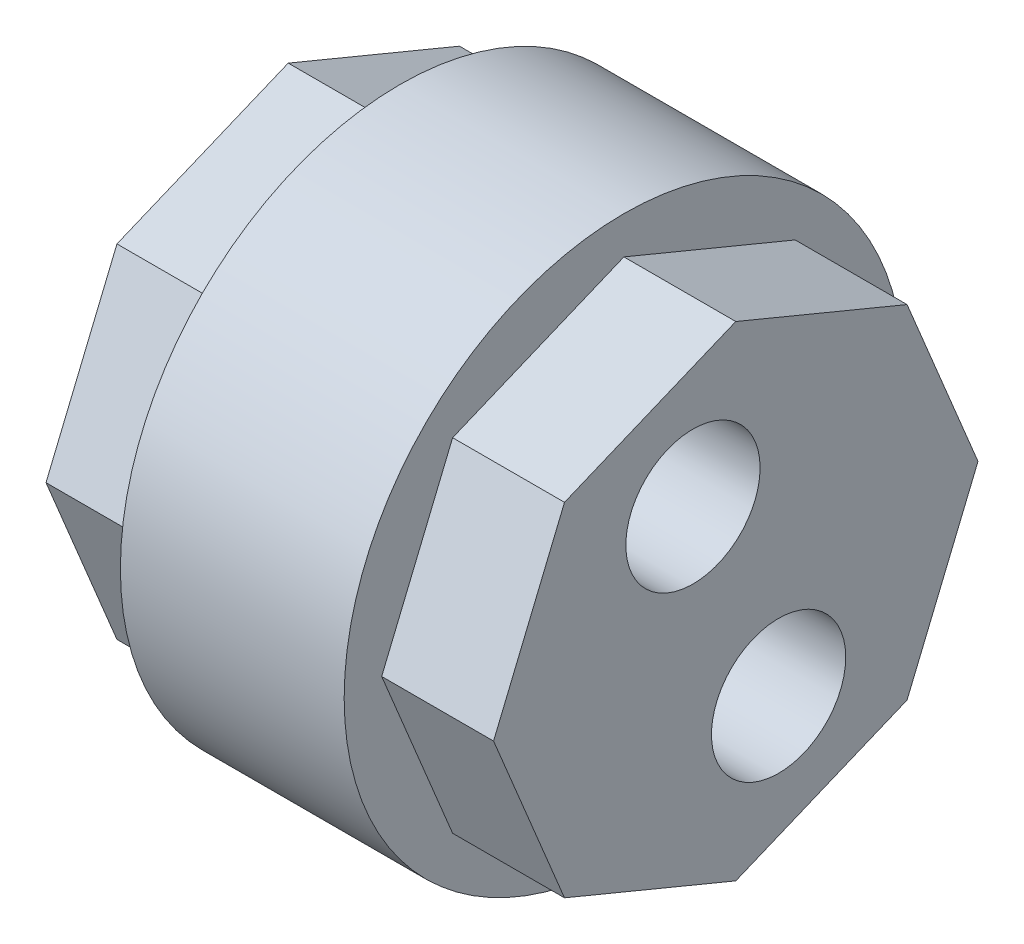
ISO-10303-21;
HEADER;
FILE_DESCRIPTION(('STEP AP214'),'2;1');
FILE_NAME('part.step','',(''),(''),'','','');
FILE_SCHEMA(('AUTOMOTIVE_DESIGN { 1 0 10303 214 1 1 1 1 }'));
ENDSEC;
DATA;
#1=APPLICATION_CONTEXT('core data for automotive mechanical design processes');
#2=APPLICATION_PROTOCOL_DEFINITION('international standard','automotive_design',2000,#1);
#3=PRODUCT_CONTEXT('',#1,'mechanical');
#4=PRODUCT('Part','Part','',(#3));
#5=PRODUCT_RELATED_PRODUCT_CATEGORY('part','',(#4));
#6=PRODUCT_DEFINITION_FORMATION('','',#4);
#7=PRODUCT_DEFINITION_CONTEXT('part definition',#1,'design');
#8=PRODUCT_DEFINITION('design','',#6,#7);
#9=PRODUCT_DEFINITION_SHAPE('','',#8);
#10=(LENGTH_UNIT() NAMED_UNIT(*) SI_UNIT(.MILLI.,.METRE.));
#11=(NAMED_UNIT(*) PLANE_ANGLE_UNIT() SI_UNIT($,.RADIAN.));
#12=(NAMED_UNIT(*) SI_UNIT($,.STERADIAN.) SOLID_ANGLE_UNIT());
#13=UNCERTAINTY_MEASURE_WITH_UNIT(LENGTH_MEASURE(1.E-05),#10,'distance_accuracy_value','');
#14=(GEOMETRIC_REPRESENTATION_CONTEXT(3) GLOBAL_UNCERTAINTY_ASSIGNED_CONTEXT((#13)) GLOBAL_UNIT_ASSIGNED_CONTEXT((#10,
#11,#12)) REPRESENTATION_CONTEXT('',''));
#15=CARTESIAN_POINT('',(0.,0.,0.));
#16=DIRECTION('',(0.,0.,1.));
#17=DIRECTION('',(1.,0.,0.));
#18=AXIS2_PLACEMENT_3D('',#15,#16,#17);
#19=CARTESIAN_POINT('',(15.,4.61939766255646,1.91341716182539));
#20=DIRECTION('',(-1.,0.,0.));
#21=DIRECTION('',(0.,0.,1.));
#22=AXIS2_PLACEMENT_3D('',#19,#20,#21);
#23=CYLINDRICAL_SURFACE('',#22,1.);
#24=CARTESIAN_POINT('',(0.,4.61939766255646,1.91341716182539));
#25=DIRECTION('',(-1.,0.,0.));
#26=DIRECTION('',(0.,0.,1.));
#27=AXIS2_PLACEMENT_3D('',#24,#25,#26);
#28=CIRCLE('',#27,1.);
#29=CARTESIAN_POINT('',(0.,4.61939766255646,2.91341716182539));
#30=VERTEX_POINT('',#29);
#31=EDGE_CURVE('E289',#30,#30,#28,.F.);
#32=ORIENTED_EDGE('',*,*,#31,.F.);
#33=EDGE_LOOP('',(#32));
#34=FACE_BOUND('',#33,.T.);
#35=CARTESIAN_POINT('',(5.,4.61939766255646,1.91341716182539));
#36=DIRECTION('',(1.,0.,0.));
#37=DIRECTION('',(0.,0.,-1.));
#38=AXIS2_PLACEMENT_3D('',#35,#36,#37);
#39=CIRCLE('',#38,1.);
#40=CARTESIAN_POINT('',(5.,4.61939766255646,0.913417161825395));
#41=VERTEX_POINT('',#40);
#42=EDGE_CURVE('E37',#41,#41,#39,.F.);
#43=ORIENTED_EDGE('',*,*,#42,.F.);
#44=EDGE_LOOP('',(#43));
#45=FACE_BOUND('',#44,.T.);
#46=ADVANCED_FACE('F33',(#34,#45),#23,.F.);
#47=CARTESIAN_POINT('',(15.,-4.61939766255646,-1.9134171618254));
#48=DIRECTION('',(-1.,0.,0.));
#49=DIRECTION('',(0.,0.,1.));
#50=AXIS2_PLACEMENT_3D('',#47,#48,#49);
#51=CYLINDRICAL_SURFACE('',#50,1.);
#52=CARTESIAN_POINT('',(0.,-4.61939766255646,-1.9134171618254));
#53=DIRECTION('',(-1.,0.,0.));
#54=DIRECTION('',(0.,0.,1.));
#55=AXIS2_PLACEMENT_3D('',#52,#53,#54);
#56=CIRCLE('',#55,1.);
#57=CARTESIAN_POINT('',(0.,-4.61939766255646,-0.913417161825397));
#58=VERTEX_POINT('',#57);
#59=EDGE_CURVE('E172',#58,#58,#56,.F.);
#60=ORIENTED_EDGE('',*,*,#59,.F.);
#61=EDGE_LOOP('',(#60));
#62=FACE_BOUND('',#61,.T.);
#63=CARTESIAN_POINT('',(5.,-4.61939766255646,-1.9134171618254));
#64=DIRECTION('',(1.,0.,0.));
#65=DIRECTION('',(0.,0.,-1.));
#66=AXIS2_PLACEMENT_3D('',#63,#64,#65);
#67=CIRCLE('',#66,1.);
#68=CARTESIAN_POINT('',(5.,-4.61939766255646,-2.9134171618254));
#69=VERTEX_POINT('',#68);
#70=EDGE_CURVE('E292',#69,#69,#67,.F.);
#71=ORIENTED_EDGE('',*,*,#70,.F.);
#72=EDGE_LOOP('',(#71));
#73=FACE_BOUND('',#72,.T.);
#74=ADVANCED_FACE('F337',(#62,#73),#51,.F.);
#75=CARTESIAN_POINT('',(10.,0.,0.));
#76=DIRECTION('',(-1.,0.,0.));
#77=DIRECTION('',(0.,0.,1.));
#78=AXIS2_PLACEMENT_3D('',#75,#76,#77);
#79=CYLINDRICAL_SURFACE('',#78,12.5);
#80=CARTESIAN_POINT('',(10.,0.,0.));
#81=DIRECTION('',(1.,0.,0.));
#82=DIRECTION('',(0.,0.,-1.));
#83=AXIS2_PLACEMENT_3D('',#80,#81,#82);
#84=CIRCLE('',#83,12.5);
#85=CARTESIAN_POINT('',(10.,0.,-12.5));
#86=VERTEX_POINT('',#85);
#87=EDGE_CURVE('E265',#86,#86,#84,.T.);
#88=ORIENTED_EDGE('',*,*,#87,.F.);
#89=EDGE_LOOP('',(#88));
#90=FACE_BOUND('',#89,.T.);
#91=CARTESIAN_POINT('',(0.,0.,0.));
#92=DIRECTION('',(1.,0.,0.));
#93=DIRECTION('',(0.,0.,-1.));
#94=AXIS2_PLACEMENT_3D('',#91,#92,#93);
#95=CIRCLE('',#94,12.5);
#96=CARTESIAN_POINT('',(0.,0.,-12.5));
#97=VERTEX_POINT('',#96);
#98=EDGE_CURVE('E264',#97,#97,#95,.T.);
#99=ORIENTED_EDGE('',*,*,#98,.T.);
#100=EDGE_LOOP('',(#99));
#101=FACE_BOUND('',#100,.T.);
#102=ADVANCED_FACE('F35',(#90,#101),#79,.T.);
#103=CARTESIAN_POINT('',(10.,0.,0.));
#104=DIRECTION('',(1.,0.,0.));
#105=DIRECTION('',(0.,0.,-1.));
#106=AXIS2_PLACEMENT_3D('',#103,#104,#105);
#107=PLANE('',#106);
#108=DIRECTION('',(0.,-0.923879532511291,-0.382683432365079));
#109=VECTOR('',#108,1.);
#110=CARTESIAN_POINT('',(10.,-3.82683432365079,9.23879532511291));
#111=LINE('',#110,#109);
#112=CARTESIAN_POINT('',(10.,1.24878290032368E-13,10.8239220029239));
#113=VERTEX_POINT('',#112);
#114=CARTESIAN_POINT('',(10.,-7.65366864730171,7.65366864730188));
#115=VERTEX_POINT('',#114);
#116=EDGE_CURVE('E262',#113,#115,#111,.T.);
#117=ORIENTED_EDGE('',*,*,#116,.F.);
#118=DIRECTION('',(0.,-0.923879532511282,0.3826834323651));
#119=VECTOR('',#118,1.);
#120=CARTESIAN_POINT('',(10.,3.826834323651,9.23879532511282));
#121=LINE('',#120,#119);
#122=CARTESIAN_POINT('',(10.,7.65366864730189,7.65366864730171));
#123=VERTEX_POINT('',#122);
#124=EDGE_CURVE('E220',#123,#113,#121,.T.);
#125=ORIENTED_EDGE('',*,*,#124,.F.);
#126=DIRECTION('',(0.,-0.382683432365079,0.923879532511291));
#127=VECTOR('',#126,1.);
#128=CARTESIAN_POINT('',(10.,9.23879532511291,3.82683432365079));
#129=LINE('',#128,#127);
#130=CARTESIAN_POINT('',(10.,10.8239220029239,-1.27068494615301E-13));
#131=VERTEX_POINT('',#130);
#132=EDGE_CURVE('E248',#131,#123,#129,.T.);
#133=ORIENTED_EDGE('',*,*,#132,.F.);
#134=DIRECTION('',(0.,0.3826834323651,0.923879532511282));
#135=VECTOR('',#134,1.);
#136=CARTESIAN_POINT('',(10.,9.23879532511282,-3.826834323651));
#137=LINE('',#136,#135);
#138=CARTESIAN_POINT('',(10.,7.65366864730171,-7.65366864730189));
#139=VERTEX_POINT('',#138);
#140=EDGE_CURVE('E251',#139,#131,#137,.T.);
#141=ORIENTED_EDGE('',*,*,#140,.F.);
#142=DIRECTION('',(0.,0.923879532511292,0.382683432365079));
#143=VECTOR('',#142,1.);
#144=CARTESIAN_POINT('',(10.,3.82683432365079,-9.23879532511291));
#145=LINE('',#144,#143);
#146=CARTESIAN_POINT('',(10.,-1.30537941567255E-13,-10.8239220029239));
#147=VERTEX_POINT('',#146);
#148=EDGE_CURVE('E254',#147,#139,#145,.T.);
#149=ORIENTED_EDGE('',*,*,#148,.F.);
#150=DIRECTION('',(0.,0.923879532511282,-0.382683432365101));
#151=VECTOR('',#150,1.);
#152=CARTESIAN_POINT('',(10.,-3.82683432365101,-9.23879532511283));
#153=LINE('',#152,#151);
#154=CARTESIAN_POINT('',(10.,-7.65366864730188,-7.65366864730171));
#155=VERTEX_POINT('',#154);
#156=EDGE_CURVE('E257',#155,#147,#153,.T.);
#157=ORIENTED_EDGE('',*,*,#156,.F.);
#158=DIRECTION('',(0.,0.382683432365079,-0.923879532511291));
#159=VECTOR('',#158,1.);
#160=CARTESIAN_POINT('',(10.,-9.23879532511291,-3.82683432365079));
#161=LINE('',#160,#159);
#162=CARTESIAN_POINT('',(10.,-10.8239220029239,1.25767452008319E-13));
#163=VERTEX_POINT('',#162);
#164=EDGE_CURVE('E55',#163,#155,#161,.T.);
#165=ORIENTED_EDGE('',*,*,#164,.F.);
#166=DIRECTION('',(0.,-0.3826834323651,-0.923879532511282));
#167=VECTOR('',#166,1.);
#168=CARTESIAN_POINT('',(10.,-9.23879532511283,3.826834323651));
#169=LINE('',#168,#167);
#170=EDGE_CURVE('E50',#115,#163,#169,.T.);
#171=ORIENTED_EDGE('',*,*,#170,.F.);
#172=EDGE_LOOP('',(#117,#125,#133,#141,#149,#157,#165,#171));
#173=FACE_BOUND('',#172,.T.);
#174=ORIENTED_EDGE('',*,*,#87,.T.);
#175=EDGE_LOOP('',(#174));
#176=FACE_BOUND('',#175,.T.);
#177=ADVANCED_FACE('F331',(#173,#176),#107,.T.);
#178=CARTESIAN_POINT('',(0.,0.,0.));
#179=DIRECTION('',(1.,0.,0.));
#180=DIRECTION('',(0.,0.,-1.));
#181=AXIS2_PLACEMENT_3D('',#178,#179,#180);
#182=PLANE('',#181);
#183=DIRECTION('',(0.,-0.923879532511282,0.3826834323651));
#184=VECTOR('',#183,1.);
#185=CARTESIAN_POINT('',(0.,3.826834323651,9.23879532511282));
#186=LINE('',#185,#184);
#187=CARTESIAN_POINT('',(0.,7.65366864730189,7.65366864730171));
#188=VERTEX_POINT('',#187);
#189=CARTESIAN_POINT('',(0.,1.24466409401336E-13,10.8239220029239));
#190=VERTEX_POINT('',#189);
#191=EDGE_CURVE('E268',#188,#190,#186,.T.);
#192=ORIENTED_EDGE('',*,*,#191,.T.);
#193=DIRECTION('',(0.,-0.923879532511291,-0.382683432365079));
#194=VECTOR('',#193,1.);
#195=CARTESIAN_POINT('',(0.,-3.82683432365079,9.23879532511291));
#196=LINE('',#195,#194);
#197=CARTESIAN_POINT('',(0.,-7.65366864730171,7.65366864730188));
#198=VERTEX_POINT('',#197);
#199=EDGE_CURVE('E11',#190,#198,#196,.T.);
#200=ORIENTED_EDGE('',*,*,#199,.T.);
#201=DIRECTION('',(0.,-0.3826834323651,-0.923879532511282));
#202=VECTOR('',#201,1.);
#203=CARTESIAN_POINT('',(0.,-9.23879532511283,3.826834323651));
#204=LINE('',#203,#202);
#205=CARTESIAN_POINT('',(0.,-10.8239220029239,1.26175578404566E-13));
#206=VERTEX_POINT('',#205);
#207=EDGE_CURVE('E42',#198,#206,#204,.T.);
#208=ORIENTED_EDGE('',*,*,#207,.T.);
#209=DIRECTION('',(0.,0.382683432365079,-0.923879532511291));
#210=VECTOR('',#209,1.);
#211=CARTESIAN_POINT('',(0.,-9.23879532511291,-3.82683432365079));
#212=LINE('',#211,#210);
#213=CARTESIAN_POINT('',(0.,-7.65366864730188,-7.65366864730171));
#214=VERTEX_POINT('',#213);
#215=EDGE_CURVE('E284',#206,#214,#212,.T.);
#216=ORIENTED_EDGE('',*,*,#215,.T.);
#217=DIRECTION('',(0.,0.923879532511282,-0.382683432365101));
#218=VECTOR('',#217,1.);
#219=CARTESIAN_POINT('',(0.,-3.82683432365101,-9.23879532511283));
#220=LINE('',#219,#218);
#221=CARTESIAN_POINT('',(0.,-1.30972173513795E-13,-10.8239220029239));
#222=VERTEX_POINT('',#221);
#223=EDGE_CURVE('E281',#214,#222,#220,.T.);
#224=ORIENTED_EDGE('',*,*,#223,.T.);
#225=DIRECTION('',(0.,0.923879532511292,0.382683432365079));
#226=VECTOR('',#225,1.);
#227=CARTESIAN_POINT('',(0.,3.82683432365079,-9.23879532511291));
#228=LINE('',#227,#226);
#229=CARTESIAN_POINT('',(0.,7.65366864730171,-7.65366864730189));
#230=VERTEX_POINT('',#229);
#231=EDGE_CURVE('E278',#222,#230,#228,.T.);
#232=ORIENTED_EDGE('',*,*,#231,.T.);
#233=DIRECTION('',(0.,0.3826834323651,0.923879532511282));
#234=VECTOR('',#233,1.);
#235=CARTESIAN_POINT('',(0.,9.23879532511282,-3.826834323651));
#236=LINE('',#235,#234);
#237=CARTESIAN_POINT('',(0.,10.8239220029239,-1.27569326949565E-13));
#238=VERTEX_POINT('',#237);
#239=EDGE_CURVE('E275',#230,#238,#236,.T.);
#240=ORIENTED_EDGE('',*,*,#239,.T.);
#241=DIRECTION('',(0.,-0.382683432365079,0.923879532511291));
#242=VECTOR('',#241,1.);
#243=CARTESIAN_POINT('',(0.,9.23879532511291,3.82683432365079));
#244=LINE('',#243,#242);
#245=EDGE_CURVE('E272',#238,#188,#244,.T.);
#246=ORIENTED_EDGE('',*,*,#245,.T.);
#247=EDGE_LOOP('',(#192,#200,#208,#216,#224,#232,#240,#246));
#248=FACE_BOUND('',#247,.T.);
#249=ORIENTED_EDGE('',*,*,#98,.F.);
#250=EDGE_LOOP('',(#249));
#251=FACE_BOUND('',#250,.T.);
#252=ADVANCED_FACE('F321',(#248,#251),#182,.F.);
#253=CARTESIAN_POINT('',(-5.,0.,0.));
#254=DIRECTION('',(-1.,0.,0.));
#255=DIRECTION('',(0.,0.,1.));
#256=AXIS2_PLACEMENT_3D('',#253,#254,#255);
#257=PLANE('',#256);
#258=CARTESIAN_POINT('',(-5.,4.61939766255646,1.91341716182539));
#259=DIRECTION('',(-1.,0.,0.));
#260=DIRECTION('',(0.,0.,1.));
#261=AXIS2_PLACEMENT_3D('',#258,#259,#260);
#262=CIRCLE('',#261,3.);
#263=CARTESIAN_POINT('',(-5.,4.61939766255646,4.91341716182539));
#264=VERTEX_POINT('',#263);
#265=EDGE_CURVE('E294',#264,#264,#262,.T.);
#266=ORIENTED_EDGE('',*,*,#265,.F.);
#267=EDGE_LOOP('',(#266));
#268=FACE_BOUND('',#267,.T.);
#269=CARTESIAN_POINT('',(-5.,-4.61939766255646,-1.9134171618254));
#270=DIRECTION('',(-1.,0.,0.));
#271=DIRECTION('',(0.,0.,1.));
#272=AXIS2_PLACEMENT_3D('',#269,#270,#271);
#273=CIRCLE('',#272,3.);
#274=CARTESIAN_POINT('',(-5.,-4.61939766255646,1.0865828381746));
#275=VERTEX_POINT('',#274);
#276=EDGE_CURVE('E178',#275,#275,#273,.T.);
#277=ORIENTED_EDGE('',*,*,#276,.F.);
#278=EDGE_LOOP('',(#277));
#279=FACE_BOUND('',#278,.T.);
#280=DIRECTION('',(0.,0.923879532511291,0.382683432365079));
#281=VECTOR('',#280,1.);
#282=CARTESIAN_POINT('',(-5.,-7.65366864730171,7.65366864730188));
#283=LINE('',#282,#281);
#284=CARTESIAN_POINT('',(-5.,-7.65366864730171,7.65366864730188));
#285=VERTEX_POINT('',#284);
#286=CARTESIAN_POINT('',(-5.,1.24878290032368E-13,10.8239220029239));
#287=VERTEX_POINT('',#286);
#288=EDGE_CURVE('E151',#285,#287,#283,.T.);
#289=ORIENTED_EDGE('',*,*,#288,.T.);
#290=DIRECTION('',(0.,0.923879532511282,-0.3826834323651));
#291=VECTOR('',#290,1.);
#292=CARTESIAN_POINT('',(-5.,1.24878290032368E-13,10.8239220029239));
#293=LINE('',#292,#291);
#294=CARTESIAN_POINT('',(-5.,7.65366864730189,7.65366864730171));
#295=VERTEX_POINT('',#294);
#296=EDGE_CURVE('E158',#287,#295,#293,.T.);
#297=ORIENTED_EDGE('',*,*,#296,.T.);
#298=DIRECTION('',(0.,0.382683432365079,-0.923879532511292));
#299=VECTOR('',#298,1.);
#300=CARTESIAN_POINT('',(-5.,7.65366864730189,7.65366864730171));
#301=LINE('',#300,#299);
#302=CARTESIAN_POINT('',(-5.,10.8239220029239,-1.27569326949565E-13));
#303=VERTEX_POINT('',#302);
#304=EDGE_CURVE('E165',#295,#303,#301,.T.);
#305=ORIENTED_EDGE('',*,*,#304,.T.);
#306=DIRECTION('',(0.,-0.3826834323651,-0.923879532511282));
#307=VECTOR('',#306,1.);
#308=CARTESIAN_POINT('',(-5.,10.8239220029239,-1.27569326949565E-13));
#309=LINE('',#308,#307);
#310=CARTESIAN_POINT('',(-5.,7.65366864730171,-7.65366864730189));
#311=VERTEX_POINT('',#310);
#312=EDGE_CURVE('E182',#303,#311,#309,.T.);
#313=ORIENTED_EDGE('',*,*,#312,.T.);
#314=DIRECTION('',(0.,-0.923879532511291,-0.382683432365079));
#315=VECTOR('',#314,1.);
#316=CARTESIAN_POINT('',(-5.,7.65366864730171,-7.65366864730189));
#317=LINE('',#316,#315);
#318=CARTESIAN_POINT('',(-5.,-1.30972173513795E-13,-10.8239220029239));
#319=VERTEX_POINT('',#318);
#320=EDGE_CURVE('E185',#311,#319,#317,.T.);
#321=ORIENTED_EDGE('',*,*,#320,.T.);
#322=DIRECTION('',(0.,-0.923879532511282,0.3826834323651));
#323=VECTOR('',#322,1.);
#324=CARTESIAN_POINT('',(-5.,-1.30972173513795E-13,-10.8239220029239));
#325=LINE('',#324,#323);
#326=CARTESIAN_POINT('',(-5.,-7.65366864730188,-7.65366864730171));
#327=VERTEX_POINT('',#326);
#328=EDGE_CURVE('E188',#319,#327,#325,.T.);
#329=ORIENTED_EDGE('',*,*,#328,.T.);
#330=DIRECTION('',(0.,-0.382683432365079,0.923879532511291));
#331=VECTOR('',#330,1.);
#332=CARTESIAN_POINT('',(-5.,-7.65366864730188,-7.65366864730171));
#333=LINE('',#332,#331);
#334=CARTESIAN_POINT('',(-5.,-10.8239220029239,1.26175578404566E-13));
#335=VERTEX_POINT('',#334);
#336=EDGE_CURVE('E191',#327,#335,#333,.T.);
#337=ORIENTED_EDGE('',*,*,#336,.T.);
#338=DIRECTION('',(0.,0.3826834323651,0.923879532511282));
#339=VECTOR('',#338,1.);
#340=CARTESIAN_POINT('',(-5.,-10.8239220029239,1.26175578404566E-13));
#341=LINE('',#340,#339);
#342=EDGE_CURVE('E171',#335,#285,#341,.T.);
#343=ORIENTED_EDGE('',*,*,#342,.T.);
#344=EDGE_LOOP('',(#289,#297,#305,#313,#321,#329,#337,#343));
#345=FACE_BOUND('',#344,.T.);
#346=ADVANCED_FACE('F168',(#268,#279,#345),#257,.T.);
#347=CARTESIAN_POINT('',(15.,1.24878290032368E-13,10.8239220029239));
#348=DIRECTION('',(0.,0.3826834323651,0.923879532511282));
#349=DIRECTION('',(0.,-0.923879532511282,0.3826834323651));
#350=AXIS2_PLACEMENT_3D('',#347,#348,#349);
#351=PLANE('',#350);
#352=ORIENTED_EDGE('',*,*,#191,.F.);
#353=DIRECTION('',(-1.,0.,0.));
#354=VECTOR('',#353,1.);
#355=CARTESIAN_POINT('',(15.,7.65366864730189,7.65366864730171));
#356=LINE('',#355,#354);
#357=EDGE_CURVE('E161',#188,#295,#356,.T.);
#358=ORIENTED_EDGE('',*,*,#357,.T.);
#359=ORIENTED_EDGE('',*,*,#296,.F.);
#360=DIRECTION('',(-1.,0.,0.));
#361=VECTOR('',#360,1.);
#362=CARTESIAN_POINT('',(15.,1.24878290032368E-13,10.8239220029239));
#363=LINE('',#362,#361);
#364=EDGE_CURVE('E146',#190,#287,#363,.T.);
#365=ORIENTED_EDGE('',*,*,#364,.F.);
#366=EDGE_LOOP('',(#352,#358,#359,#365));
#367=FACE_BOUND('',#366,.T.);
#368=ADVANCED_FACE('F159',(#367),#351,.T.);
#369=CARTESIAN_POINT('',(15.,7.65366864730189,7.65366864730171));
#370=DIRECTION('',(0.,0.923879532511291,0.382683432365079));
#371=DIRECTION('',(0.,-0.382683432365079,0.923879532511291));
#372=AXIS2_PLACEMENT_3D('',#369,#370,#371);
#373=PLANE('',#372);
#374=ORIENTED_EDGE('',*,*,#245,.F.);
#375=DIRECTION('',(-1.,0.,0.));
#376=VECTOR('',#375,1.);
#377=CARTESIAN_POINT('',(15.,10.8239220029239,-1.27569326949565E-13));
#378=LINE('',#377,#376);
#379=EDGE_CURVE('E241',#238,#303,#378,.T.);
#380=ORIENTED_EDGE('',*,*,#379,.T.);
#381=ORIENTED_EDGE('',*,*,#304,.F.);
#382=ORIENTED_EDGE('',*,*,#357,.F.);
#383=EDGE_LOOP('',(#374,#380,#381,#382));
#384=FACE_BOUND('',#383,.T.);
#385=ADVANCED_FACE('F328',(#384),#373,.T.);
#386=CARTESIAN_POINT('',(15.,10.8239220029239,-1.27569326949565E-13));
#387=DIRECTION('',(0.,0.923879532511282,-0.3826834323651));
#388=DIRECTION('',(0.,0.3826834323651,0.923879532511282));
#389=AXIS2_PLACEMENT_3D('',#386,#387,#388);
#390=PLANE('',#389);
#391=ORIENTED_EDGE('',*,*,#239,.F.);
#392=DIRECTION('',(-1.,0.,0.));
#393=VECTOR('',#392,1.);
#394=CARTESIAN_POINT('',(15.,7.65366864730171,-7.65366864730189));
#395=LINE('',#394,#393);
#396=EDGE_CURVE('E237',#230,#311,#395,.T.);
#397=ORIENTED_EDGE('',*,*,#396,.T.);
#398=ORIENTED_EDGE('',*,*,#312,.F.);
#399=ORIENTED_EDGE('',*,*,#379,.F.);
#400=EDGE_LOOP('',(#391,#397,#398,#399));
#401=FACE_BOUND('',#400,.T.);
#402=ADVANCED_FACE('F452',(#401),#390,.T.);
#403=CARTESIAN_POINT('',(15.,7.65366864730171,-7.65366864730189));
#404=DIRECTION('',(0.,0.382683432365079,-0.923879532511291));
#405=DIRECTION('',(0.,0.923879532511292,0.382683432365079));
#406=AXIS2_PLACEMENT_3D('',#403,#404,#405);
#407=PLANE('',#406);
#408=ORIENTED_EDGE('',*,*,#231,.F.);
#409=DIRECTION('',(-1.,0.,0.));
#410=VECTOR('',#409,1.);
#411=CARTESIAN_POINT('',(15.,-1.30972173513795E-13,-10.8239220029239));
#412=LINE('',#411,#410);
#413=EDGE_CURVE('E233',#222,#319,#412,.T.);
#414=ORIENTED_EDGE('',*,*,#413,.T.);
#415=ORIENTED_EDGE('',*,*,#320,.F.);
#416=ORIENTED_EDGE('',*,*,#396,.F.);
#417=EDGE_LOOP('',(#408,#414,#415,#416));
#418=FACE_BOUND('',#417,.T.);
#419=ADVANCED_FACE('F462',(#418),#407,.T.);
#420=CARTESIAN_POINT('',(15.,-1.30972173513795E-13,-10.8239220029239));
#421=DIRECTION('',(0.,-0.382683432365101,-0.923879532511282));
#422=DIRECTION('',(0.,0.923879532511282,-0.382683432365101));
#423=AXIS2_PLACEMENT_3D('',#420,#421,#422);
#424=PLANE('',#423);
#425=ORIENTED_EDGE('',*,*,#223,.F.);
#426=DIRECTION('',(-1.,0.,0.));
#427=VECTOR('',#426,1.);
#428=CARTESIAN_POINT('',(15.,-7.65366864730188,-7.65366864730171));
#429=LINE('',#428,#427);
#430=EDGE_CURVE('E229',#214,#327,#429,.T.);
#431=ORIENTED_EDGE('',*,*,#430,.T.);
#432=ORIENTED_EDGE('',*,*,#328,.F.);
#433=ORIENTED_EDGE('',*,*,#413,.F.);
#434=EDGE_LOOP('',(#425,#431,#432,#433));
#435=FACE_BOUND('',#434,.T.);
#436=ADVANCED_FACE('F472',(#435),#424,.T.);
#437=CARTESIAN_POINT('',(15.,-7.65366864730188,-7.65366864730171));
#438=DIRECTION('',(0.,-0.923879532511291,-0.382683432365079));
#439=DIRECTION('',(0.,0.382683432365079,-0.923879532511291));
#440=AXIS2_PLACEMENT_3D('',#437,#438,#439);
#441=PLANE('',#440);
#442=ORIENTED_EDGE('',*,*,#215,.F.);
#443=DIRECTION('',(-1.,0.,0.));
#444=VECTOR('',#443,1.);
#445=CARTESIAN_POINT('',(15.,-10.8239220029239,1.26175578404566E-13));
#446=LINE('',#445,#444);
#447=EDGE_CURVE('E225',#206,#335,#446,.T.);
#448=ORIENTED_EDGE('',*,*,#447,.T.);
#449=ORIENTED_EDGE('',*,*,#336,.F.);
#450=ORIENTED_EDGE('',*,*,#430,.F.);
#451=EDGE_LOOP('',(#442,#448,#449,#450));
#452=FACE_BOUND('',#451,.T.);
#453=ADVANCED_FACE('F482',(#452),#441,.T.);
#454=CARTESIAN_POINT('',(15.,-10.8239220029239,1.26175578404566E-13));
#455=DIRECTION('',(0.,-0.923879532511282,0.3826834323651));
#456=DIRECTION('',(0.,-0.3826834323651,-0.923879532511282));
#457=AXIS2_PLACEMENT_3D('',#454,#455,#456);
#458=PLANE('',#457);
#459=ORIENTED_EDGE('',*,*,#207,.F.);
#460=DIRECTION('',(-1.,0.,0.));
#461=VECTOR('',#460,1.);
#462=CARTESIAN_POINT('',(15.,-7.65366864730171,7.65366864730188));
#463=LINE('',#462,#461);
#464=EDGE_CURVE('E221',#198,#285,#463,.T.);
#465=ORIENTED_EDGE('',*,*,#464,.T.);
#466=ORIENTED_EDGE('',*,*,#342,.F.);
#467=ORIENTED_EDGE('',*,*,#447,.F.);
#468=EDGE_LOOP('',(#459,#465,#466,#467));
#469=FACE_BOUND('',#468,.T.);
#470=ADVANCED_FACE('F492',(#469),#458,.T.);
#471=CARTESIAN_POINT('',(15.,-7.65366864730171,7.65366864730188));
#472=DIRECTION('',(0.,-0.382683432365079,0.923879532511291));
#473=DIRECTION('',(0.,-0.923879532511291,-0.382683432365079));
#474=AXIS2_PLACEMENT_3D('',#471,#472,#473);
#475=PLANE('',#474);
#476=ORIENTED_EDGE('',*,*,#199,.F.);
#477=ORIENTED_EDGE('',*,*,#364,.T.);
#478=ORIENTED_EDGE('',*,*,#288,.F.);
#479=ORIENTED_EDGE('',*,*,#464,.F.);
#480=EDGE_LOOP('',(#476,#477,#478,#479));
#481=FACE_BOUND('',#480,.T.);
#482=ADVANCED_FACE('F148',(#481),#475,.T.);
#483=CARTESIAN_POINT('',(15.,1.24878290032368E-13,10.8239220029239));
#484=VERTEX_POINT('',#483);
#485=EDGE_CURVE('E154',#484,#113,#363,.T.);
#486=ORIENTED_EDGE('',*,*,#485,.T.);
#487=ORIENTED_EDGE('',*,*,#116,.T.);
#488=CARTESIAN_POINT('',(15.,-7.65366864730171,7.65366864730188));
#489=VERTEX_POINT('',#488);
#490=EDGE_CURVE('E217',#489,#115,#463,.T.);
#491=ORIENTED_EDGE('',*,*,#490,.F.);
#492=DIRECTION('',(0.,0.923879532511291,0.382683432365079));
#493=VECTOR('',#492,1.);
#494=CARTESIAN_POINT('',(15.,-7.65366864730171,7.65366864730188));
#495=LINE('',#494,#493);
#496=EDGE_CURVE('E194',#489,#484,#495,.T.);
#497=ORIENTED_EDGE('',*,*,#496,.T.);
#498=EDGE_LOOP('',(#486,#487,#491,#497));
#499=FACE_BOUND('',#498,.T.);
#500=ADVANCED_FACE('F414',(#499),#475,.T.);
#501=ORIENTED_EDGE('',*,*,#490,.T.);
#502=ORIENTED_EDGE('',*,*,#170,.T.);
#503=CARTESIAN_POINT('',(15.,-10.8239220029239,1.26175578404566E-13));
#504=VERTEX_POINT('',#503);
#505=EDGE_CURVE('E222',#504,#163,#446,.T.);
#506=ORIENTED_EDGE('',*,*,#505,.F.);
#507=DIRECTION('',(0.,0.3826834323651,0.923879532511282));
#508=VECTOR('',#507,1.);
#509=CARTESIAN_POINT('',(15.,-10.8239220029239,1.26175578404566E-13));
#510=LINE('',#509,#508);
#511=EDGE_CURVE('E155',#504,#489,#510,.T.);
#512=ORIENTED_EDGE('',*,*,#511,.T.);
#513=EDGE_LOOP('',(#501,#502,#506,#512));
#514=FACE_BOUND('',#513,.T.);
#515=ADVANCED_FACE('F399',(#514),#458,.T.);
#516=ORIENTED_EDGE('',*,*,#505,.T.);
#517=ORIENTED_EDGE('',*,*,#164,.T.);
#518=CARTESIAN_POINT('',(15.,-7.65366864730188,-7.65366864730171));
#519=VERTEX_POINT('',#518);
#520=EDGE_CURVE('E226',#519,#155,#429,.T.);
#521=ORIENTED_EDGE('',*,*,#520,.F.);
#522=DIRECTION('',(0.,-0.382683432365079,0.923879532511291));
#523=VECTOR('',#522,1.);
#524=CARTESIAN_POINT('',(15.,-7.65366864730188,-7.65366864730171));
#525=LINE('',#524,#523);
#526=EDGE_CURVE('E212',#519,#504,#525,.T.);
#527=ORIENTED_EDGE('',*,*,#526,.T.);
#528=EDGE_LOOP('',(#516,#517,#521,#527));
#529=FACE_BOUND('',#528,.T.);
#530=ADVANCED_FACE('F401',(#529),#441,.T.);
#531=ORIENTED_EDGE('',*,*,#520,.T.);
#532=ORIENTED_EDGE('',*,*,#156,.T.);
#533=CARTESIAN_POINT('',(15.,-1.30972173513795E-13,-10.8239220029239));
#534=VERTEX_POINT('',#533);
#535=EDGE_CURVE('E230',#534,#147,#412,.T.);
#536=ORIENTED_EDGE('',*,*,#535,.F.);
#537=DIRECTION('',(0.,-0.923879532511282,0.3826834323651));
#538=VECTOR('',#537,1.);
#539=CARTESIAN_POINT('',(15.,-1.30972173513795E-13,-10.8239220029239));
#540=LINE('',#539,#538);
#541=EDGE_CURVE('E209',#534,#519,#540,.T.);
#542=ORIENTED_EDGE('',*,*,#541,.T.);
#543=EDGE_LOOP('',(#531,#532,#536,#542));
#544=FACE_BOUND('',#543,.T.);
#545=ADVANCED_FACE('F405',(#544),#424,.T.);
#546=ORIENTED_EDGE('',*,*,#535,.T.);
#547=ORIENTED_EDGE('',*,*,#148,.T.);
#548=CARTESIAN_POINT('',(15.,7.65366864730171,-7.65366864730189));
#549=VERTEX_POINT('',#548);
#550=EDGE_CURVE('E234',#549,#139,#395,.T.);
#551=ORIENTED_EDGE('',*,*,#550,.F.);
#552=DIRECTION('',(0.,-0.923879532511291,-0.382683432365079));
#553=VECTOR('',#552,1.);
#554=CARTESIAN_POINT('',(15.,7.65366864730171,-7.65366864730189));
#555=LINE('',#554,#553);
#556=EDGE_CURVE('E206',#549,#534,#555,.T.);
#557=ORIENTED_EDGE('',*,*,#556,.T.);
#558=EDGE_LOOP('',(#546,#547,#551,#557));
#559=FACE_BOUND('',#558,.T.);
#560=ADVANCED_FACE('F407',(#559),#407,.T.);
#561=ORIENTED_EDGE('',*,*,#550,.T.);
#562=ORIENTED_EDGE('',*,*,#140,.T.);
#563=CARTESIAN_POINT('',(15.,10.8239220029239,-1.27569326949565E-13));
#564=VERTEX_POINT('',#563);
#565=EDGE_CURVE('E238',#564,#131,#378,.T.);
#566=ORIENTED_EDGE('',*,*,#565,.F.);
#567=DIRECTION('',(0.,-0.3826834323651,-0.923879532511282));
#568=VECTOR('',#567,1.);
#569=CARTESIAN_POINT('',(15.,10.8239220029239,-1.27569326949565E-13));
#570=LINE('',#569,#568);
#571=EDGE_CURVE('E203',#564,#549,#570,.T.);
#572=ORIENTED_EDGE('',*,*,#571,.T.);
#573=EDGE_LOOP('',(#561,#562,#566,#572));
#574=FACE_BOUND('',#573,.T.);
#575=ADVANCED_FACE('F410',(#574),#390,.T.);
#576=ORIENTED_EDGE('',*,*,#565,.T.);
#577=ORIENTED_EDGE('',*,*,#132,.T.);
#578=CARTESIAN_POINT('',(15.,7.65366864730189,7.65366864730171));
#579=VERTEX_POINT('',#578);
#580=EDGE_CURVE('E242',#579,#123,#356,.T.);
#581=ORIENTED_EDGE('',*,*,#580,.F.);
#582=DIRECTION('',(0.,0.382683432365079,-0.923879532511292));
#583=VECTOR('',#582,1.);
#584=CARTESIAN_POINT('',(15.,7.65366864730189,7.65366864730171));
#585=LINE('',#584,#583);
#586=EDGE_CURVE('E200',#579,#564,#585,.T.);
#587=ORIENTED_EDGE('',*,*,#586,.T.);
#588=EDGE_LOOP('',(#576,#577,#581,#587));
#589=FACE_BOUND('',#588,.T.);
#590=ADVANCED_FACE('F412',(#589),#373,.T.);
#591=ORIENTED_EDGE('',*,*,#580,.T.);
#592=ORIENTED_EDGE('',*,*,#124,.T.);
#593=ORIENTED_EDGE('',*,*,#485,.F.);
#594=DIRECTION('',(0.,0.923879532511282,-0.3826834323651));
#595=VECTOR('',#594,1.);
#596=CARTESIAN_POINT('',(15.,1.24878290032368E-13,10.8239220029239));
#597=LINE('',#596,#595);
#598=EDGE_CURVE('E197',#484,#579,#597,.T.);
#599=ORIENTED_EDGE('',*,*,#598,.T.);
#600=EDGE_LOOP('',(#591,#592,#593,#599));
#601=FACE_BOUND('',#600,.T.);
#602=ADVANCED_FACE('F330',(#601),#351,.T.);
#603=CARTESIAN_POINT('',(15.,0.,0.));
#604=DIRECTION('',(-1.,0.,0.));
#605=DIRECTION('',(0.,0.,1.));
#606=AXIS2_PLACEMENT_3D('',#603,#604,#605);
#607=PLANE('',#606);
#608=CARTESIAN_POINT('',(15.,4.61939766255646,1.91341716182539));
#609=DIRECTION('',(1.,0.,0.));
#610=DIRECTION('',(0.,0.,-1.));
#611=AXIS2_PLACEMENT_3D('',#608,#609,#610);
#612=CIRCLE('',#611,3.);
#613=CARTESIAN_POINT('',(15.,4.61939766255646,-1.08658283817461));
#614=VERTEX_POINT('',#613);
#615=EDGE_CURVE('E308',#614,#614,#612,.T.);
#616=ORIENTED_EDGE('',*,*,#615,.F.);
#617=EDGE_LOOP('',(#616));
#618=FACE_BOUND('',#617,.T.);
#619=CARTESIAN_POINT('',(15.,-4.61939766255646,-1.9134171618254));
#620=DIRECTION('',(1.,0.,0.));
#621=DIRECTION('',(0.,0.,-1.));
#622=AXIS2_PLACEMENT_3D('',#619,#620,#621);
#623=CIRCLE('',#622,3.);
#624=CARTESIAN_POINT('',(15.,-4.61939766255646,-4.9134171618254));
#625=VERTEX_POINT('',#624);
#626=EDGE_CURVE('E301',#625,#625,#623,.T.);
#627=ORIENTED_EDGE('',*,*,#626,.F.);
#628=EDGE_LOOP('',(#627));
#629=FACE_BOUND('',#628,.T.);
#630=ORIENTED_EDGE('',*,*,#496,.F.);
#631=ORIENTED_EDGE('',*,*,#511,.F.);
#632=ORIENTED_EDGE('',*,*,#526,.F.);
#633=ORIENTED_EDGE('',*,*,#541,.F.);
#634=ORIENTED_EDGE('',*,*,#556,.F.);
#635=ORIENTED_EDGE('',*,*,#571,.F.);
#636=ORIENTED_EDGE('',*,*,#586,.F.);
#637=ORIENTED_EDGE('',*,*,#598,.F.);
#638=EDGE_LOOP('',(#630,#631,#632,#633,#634,#635,#636,#637));
#639=FACE_BOUND('',#638,.T.);
#640=ADVANCED_FACE('F354',(#618,#629,#639),#607,.F.);
#641=CARTESIAN_POINT('',(0.,-4.61939766255646,-1.9134171618254));
#642=DIRECTION('',(-1.,0.,0.));
#643=DIRECTION('',(0.,0.,1.));
#644=AXIS2_PLACEMENT_3D('',#641,#642,#643);
#645=PLANE('',#644);
#646=CARTESIAN_POINT('',(0.,-4.61939766255646,-1.9134171618254));
#647=DIRECTION('',(-1.,0.,0.));
#648=DIRECTION('',(0.,0.,1.));
#649=AXIS2_PLACEMENT_3D('',#646,#647,#648);
#650=CIRCLE('',#649,3.);
#651=CARTESIAN_POINT('',(0.,-4.61939766255646,1.0865828381746));
#652=VERTEX_POINT('',#651);
#653=EDGE_CURVE('E175',#652,#652,#650,.T.);
#654=ORIENTED_EDGE('',*,*,#653,.T.);
#655=EDGE_LOOP('',(#654));
#656=FACE_BOUND('',#655,.T.);
#657=ORIENTED_EDGE('',*,*,#59,.T.);
#658=EDGE_LOOP('',(#657));
#659=FACE_BOUND('',#658,.T.);
#660=ADVANCED_FACE('F350',(#656,#659),#645,.T.);
#661=CARTESIAN_POINT('',(0.,-4.61939766255646,-1.9134171618254));
#662=DIRECTION('',(-1.,0.,0.));
#663=DIRECTION('',(0.,0.,1.));
#664=AXIS2_PLACEMENT_3D('',#661,#662,#663);
#665=CYLINDRICAL_SURFACE('',#664,3.);
#666=ORIENTED_EDGE('',*,*,#653,.F.);
#667=EDGE_LOOP('',(#666));
#668=FACE_BOUND('',#667,.T.);
#669=ORIENTED_EDGE('',*,*,#276,.T.);
#670=EDGE_LOOP('',(#669));
#671=FACE_BOUND('',#670,.T.);
#672=ADVANCED_FACE('F318',(#668,#671),#665,.F.);
#673=CARTESIAN_POINT('',(0.,4.61939766255646,1.91341716182539));
#674=DIRECTION('',(-1.,0.,0.));
#675=DIRECTION('',(0.,0.,1.));
#676=AXIS2_PLACEMENT_3D('',#673,#674,#675);
#677=PLANE('',#676);
#678=CARTESIAN_POINT('',(0.,4.61939766255646,1.91341716182539));
#679=DIRECTION('',(-1.,0.,0.));
#680=DIRECTION('',(0.,0.,1.));
#681=AXIS2_PLACEMENT_3D('',#678,#679,#680);
#682=CIRCLE('',#681,3.);
#683=CARTESIAN_POINT('',(0.,4.61939766255646,4.91341716182539));
#684=VERTEX_POINT('',#683);
#685=EDGE_CURVE('E291',#684,#684,#682,.T.);
#686=ORIENTED_EDGE('',*,*,#685,.T.);
#687=EDGE_LOOP('',(#686));
#688=FACE_BOUND('',#687,.T.);
#689=ORIENTED_EDGE('',*,*,#31,.T.);
#690=EDGE_LOOP('',(#689));
#691=FACE_BOUND('',#690,.T.);
#692=ADVANCED_FACE('F349',(#688,#691),#677,.T.);
#693=CARTESIAN_POINT('',(0.,4.61939766255646,1.91341716182539));
#694=DIRECTION('',(-1.,0.,0.));
#695=DIRECTION('',(0.,0.,1.));
#696=AXIS2_PLACEMENT_3D('',#693,#694,#695);
#697=CYLINDRICAL_SURFACE('',#696,3.);
#698=ORIENTED_EDGE('',*,*,#685,.F.);
#699=EDGE_LOOP('',(#698));
#700=FACE_BOUND('',#699,.T.);
#701=ORIENTED_EDGE('',*,*,#265,.T.);
#702=EDGE_LOOP('',(#701));
#703=FACE_BOUND('',#702,.T.);
#704=ADVANCED_FACE('F355',(#700,#703),#697,.F.);
#705=CARTESIAN_POINT('',(5.,-4.61939766255646,-1.9134171618254));
#706=DIRECTION('',(1.,0.,0.));
#707=DIRECTION('',(0.,0.,-1.));
#708=AXIS2_PLACEMENT_3D('',#705,#706,#707);
#709=PLANE('',#708);
#710=CARTESIAN_POINT('',(5.,-4.61939766255646,-1.9134171618254));
#711=DIRECTION('',(1.,0.,0.));
#712=DIRECTION('',(0.,0.,-1.));
#713=AXIS2_PLACEMENT_3D('',#710,#711,#712);
#714=CIRCLE('',#713,3.);
#715=CARTESIAN_POINT('',(5.,-4.61939766255646,-4.9134171618254));
#716=VERTEX_POINT('',#715);
#717=EDGE_CURVE('E295',#716,#716,#714,.T.);
#718=ORIENTED_EDGE('',*,*,#717,.T.);
#719=EDGE_LOOP('',(#718));
#720=FACE_BOUND('',#719,.T.);
#721=ORIENTED_EDGE('',*,*,#70,.T.);
#722=EDGE_LOOP('',(#721));
#723=FACE_BOUND('',#722,.T.);
#724=ADVANCED_FACE('F358',(#720,#723),#709,.T.);
#725=CARTESIAN_POINT('',(5.,-4.61939766255646,-1.9134171618254));
#726=DIRECTION('',(1.,0.,0.));
#727=DIRECTION('',(0.,0.,-1.));
#728=AXIS2_PLACEMENT_3D('',#725,#726,#727);
#729=CYLINDRICAL_SURFACE('',#728,3.);
#730=ORIENTED_EDGE('',*,*,#717,.F.);
#731=EDGE_LOOP('',(#730));
#732=FACE_BOUND('',#731,.T.);
#733=ORIENTED_EDGE('',*,*,#626,.T.);
#734=EDGE_LOOP('',(#733));
#735=FACE_BOUND('',#734,.T.);
#736=ADVANCED_FACE('F363',(#732,#735),#729,.F.);
#737=CARTESIAN_POINT('',(5.,4.61939766255646,1.91341716182539));
#738=DIRECTION('',(1.,0.,0.));
#739=DIRECTION('',(0.,0.,-1.));
#740=AXIS2_PLACEMENT_3D('',#737,#738,#739);
#741=PLANE('',#740);
#742=CARTESIAN_POINT('',(5.,4.61939766255646,1.91341716182539));
#743=DIRECTION('',(1.,0.,0.));
#744=DIRECTION('',(0.,0.,-1.));
#745=AXIS2_PLACEMENT_3D('',#742,#743,#744);
#746=CIRCLE('',#745,3.);
#747=CARTESIAN_POINT('',(5.,4.61939766255646,-1.08658283817461));
#748=VERTEX_POINT('',#747);
#749=EDGE_CURVE('E381',#748,#748,#746,.T.);
#750=ORIENTED_EDGE('',*,*,#749,.T.);
#751=EDGE_LOOP('',(#750));
#752=FACE_BOUND('',#751,.T.);
#753=ORIENTED_EDGE('',*,*,#42,.T.);
#754=EDGE_LOOP('',(#753));
#755=FACE_BOUND('',#754,.T.);
#756=ADVANCED_FACE('F366',(#752,#755),#741,.T.);
#757=CARTESIAN_POINT('',(5.,4.61939766255646,1.91341716182539));
#758=DIRECTION('',(1.,0.,0.));
#759=DIRECTION('',(0.,0.,-1.));
#760=AXIS2_PLACEMENT_3D('',#757,#758,#759);
#761=CYLINDRICAL_SURFACE('',#760,3.);
#762=ORIENTED_EDGE('',*,*,#749,.F.);
#763=EDGE_LOOP('',(#762));
#764=FACE_BOUND('',#763,.T.);
#765=ORIENTED_EDGE('',*,*,#615,.T.);
#766=EDGE_LOOP('',(#765));
#767=FACE_BOUND('',#766,.T.);
#768=ADVANCED_FACE('F370',(#764,#767),#761,.F.);
#769=CLOSED_SHELL('',(#46,#74,#102,#177,#252,#346,#368,#385,#402,#419,#436,#453,#470,#482,#500,
#515,#530,#545,#560,#575,#590,#602,#640,#660,#672,#692,#704,#724,#736,#756,#768));
#770=MANIFOLD_SOLID_BREP('B2',#769);
#771=ADVANCED_BREP_SHAPE_REPRESENTATION('',(#18,#770),#14);
#772=SHAPE_DEFINITION_REPRESENTATION(#9,#771);
ENDSEC;
END-ISO-10303-21;
